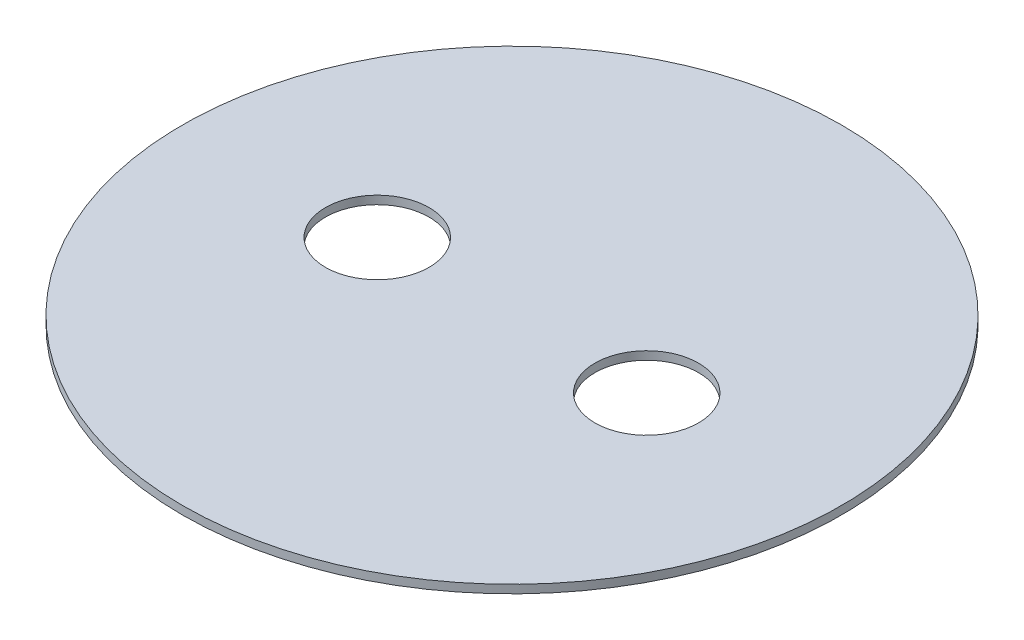
ISO-10303-21;
HEADER;
FILE_DESCRIPTION(('STEP AP214'),'2;1');
FILE_NAME('part.step','',(''),(''),'','','');
FILE_SCHEMA(('AUTOMOTIVE_DESIGN { 1 0 10303 214 1 1 1 1 }'));
ENDSEC;
DATA;
#1=APPLICATION_CONTEXT('core data for automotive mechanical design processes');
#2=APPLICATION_PROTOCOL_DEFINITION('international standard','automotive_design',2000,#1);
#3=PRODUCT_CONTEXT('',#1,'mechanical');
#4=PRODUCT('Part','Part','',(#3));
#5=PRODUCT_RELATED_PRODUCT_CATEGORY('part','',(#4));
#6=PRODUCT_DEFINITION_FORMATION('','',#4);
#7=PRODUCT_DEFINITION_CONTEXT('part definition',#1,'design');
#8=PRODUCT_DEFINITION('design','',#6,#7);
#9=PRODUCT_DEFINITION_SHAPE('','',#8);
#10=(LENGTH_UNIT() NAMED_UNIT(*) SI_UNIT(.MILLI.,.METRE.));
#11=(NAMED_UNIT(*) PLANE_ANGLE_UNIT() SI_UNIT($,.RADIAN.));
#12=(NAMED_UNIT(*) SI_UNIT($,.STERADIAN.) SOLID_ANGLE_UNIT());
#13=UNCERTAINTY_MEASURE_WITH_UNIT(LENGTH_MEASURE(1.E-05),#10,'distance_accuracy_value','');
#14=(GEOMETRIC_REPRESENTATION_CONTEXT(3) GLOBAL_UNCERTAINTY_ASSIGNED_CONTEXT((#13)) GLOBAL_UNIT_ASSIGNED_CONTEXT((#10,
#11,#12)) REPRESENTATION_CONTEXT('',''));
#15=CARTESIAN_POINT('',(0.,0.,0.));
#16=DIRECTION('',(0.,0.,1.));
#17=DIRECTION('',(1.,0.,0.));
#18=AXIS2_PLACEMENT_3D('',#15,#16,#17);
#19=CARTESIAN_POINT('',(0.,2.,0.));
#20=DIRECTION('',(0.,1.,0.));
#21=DIRECTION('',(0.,0.,1.));
#22=AXIS2_PLACEMENT_3D('',#19,#20,#21);
#23=PLANE('',#22);
#24=CARTESIAN_POINT('',(-32.5,2.,0.));
#25=DIRECTION('',(0.,1.,0.));
#26=DIRECTION('',(0.,0.,1.));
#27=AXIS2_PLACEMENT_3D('',#24,#25,#26);
#28=CIRCLE('',#27,12.5);
#29=CARTESIAN_POINT('',(-32.5,2.,12.5));
#30=VERTEX_POINT('',#29);
#31=EDGE_CURVE('E58',#30,#30,#28,.T.);
#32=ORIENTED_EDGE('',*,*,#31,.F.);
#33=EDGE_LOOP('',(#32));
#34=FACE_BOUND('',#33,.T.);
#35=CARTESIAN_POINT('',(0.,2.,0.));
#36=DIRECTION('',(0.,1.,0.));
#37=DIRECTION('',(0.,0.,1.));
#38=AXIS2_PLACEMENT_3D('',#35,#36,#37);
#39=CIRCLE('',#38,79.5);
#40=CARTESIAN_POINT('',(0.,2.,79.5));
#41=VERTEX_POINT('',#40);
#42=EDGE_CURVE('E11',#41,#41,#39,.T.);
#43=ORIENTED_EDGE('',*,*,#42,.T.);
#44=EDGE_LOOP('',(#43));
#45=FACE_BOUND('',#44,.T.);
#46=CARTESIAN_POINT('',(32.5,2.,0.));
#47=DIRECTION('',(0.,1.,0.));
#48=DIRECTION('',(0.,0.,1.));
#49=AXIS2_PLACEMENT_3D('',#46,#47,#48);
#50=CIRCLE('',#49,12.5);
#51=CARTESIAN_POINT('',(32.5,2.,12.5));
#52=VERTEX_POINT('',#51);
#53=EDGE_CURVE('E69',#52,#52,#50,.T.);
#54=ORIENTED_EDGE('',*,*,#53,.F.);
#55=EDGE_LOOP('',(#54));
#56=FACE_BOUND('',#55,.T.);
#57=ADVANCED_FACE('F41',(#34,#45,#56),#23,.T.);
#58=CARTESIAN_POINT('',(0.,0.,0.));
#59=DIRECTION('',(0.,1.,0.));
#60=DIRECTION('',(0.,0.,1.));
#61=AXIS2_PLACEMENT_3D('',#58,#59,#60);
#62=PLANE('',#61);
#63=CARTESIAN_POINT('',(0.,0.,0.));
#64=DIRECTION('',(0.,1.,0.));
#65=DIRECTION('',(0.,0.,1.));
#66=AXIS2_PLACEMENT_3D('',#63,#64,#65);
#67=CIRCLE('',#66,79.5);
#68=CARTESIAN_POINT('',(0.,0.,79.5));
#69=VERTEX_POINT('',#68);
#70=EDGE_CURVE('E46',#69,#69,#67,.T.);
#71=ORIENTED_EDGE('',*,*,#70,.F.);
#72=EDGE_LOOP('',(#71));
#73=FACE_BOUND('',#72,.T.);
#74=CARTESIAN_POINT('',(-32.5,0.,0.));
#75=DIRECTION('',(0.,1.,0.));
#76=DIRECTION('',(0.,0.,1.));
#77=AXIS2_PLACEMENT_3D('',#74,#75,#76);
#78=CIRCLE('',#77,12.5);
#79=CARTESIAN_POINT('',(-32.5,0.,12.5));
#80=VERTEX_POINT('',#79);
#81=EDGE_CURVE('E61',#80,#80,#78,.T.);
#82=ORIENTED_EDGE('',*,*,#81,.T.);
#83=EDGE_LOOP('',(#82));
#84=FACE_BOUND('',#83,.T.);
#85=CARTESIAN_POINT('',(32.5,0.,0.));
#86=DIRECTION('',(0.,1.,0.));
#87=DIRECTION('',(0.,0.,1.));
#88=AXIS2_PLACEMENT_3D('',#85,#86,#87);
#89=CIRCLE('',#88,12.5);
#90=CARTESIAN_POINT('',(32.5,0.,12.5));
#91=VERTEX_POINT('',#90);
#92=EDGE_CURVE('E72',#91,#91,#89,.T.);
#93=ORIENTED_EDGE('',*,*,#92,.T.);
#94=EDGE_LOOP('',(#93));
#95=FACE_BOUND('',#94,.T.);
#96=ADVANCED_FACE('F84',(#73,#84,#95),#62,.F.);
#97=CARTESIAN_POINT('',(0.,2.,0.));
#98=DIRECTION('',(0.,-1.,0.));
#99=DIRECTION('',(0.,0.,-1.));
#100=AXIS2_PLACEMENT_3D('',#97,#98,#99);
#101=CYLINDRICAL_SURFACE('',#100,79.5);
#102=ORIENTED_EDGE('',*,*,#42,.F.);
#103=EDGE_LOOP('',(#102));
#104=FACE_BOUND('',#103,.T.);
#105=ORIENTED_EDGE('',*,*,#70,.T.);
#106=EDGE_LOOP('',(#105));
#107=FACE_BOUND('',#106,.T.);
#108=ADVANCED_FACE('F44',(#104,#107),#101,.T.);
#109=CARTESIAN_POINT('',(-32.5,2.,0.));
#110=DIRECTION('',(0.,-1.,0.));
#111=DIRECTION('',(0.,0.,-1.));
#112=AXIS2_PLACEMENT_3D('',#109,#110,#111);
#113=CYLINDRICAL_SURFACE('',#112,12.5);
#114=ORIENTED_EDGE('',*,*,#31,.T.);
#115=EDGE_LOOP('',(#114));
#116=FACE_BOUND('',#115,.T.);
#117=ORIENTED_EDGE('',*,*,#81,.F.);
#118=EDGE_LOOP('',(#117));
#119=FACE_BOUND('',#118,.T.);
#120=ADVANCED_FACE('F87',(#116,#119),#113,.F.);
#121=CARTESIAN_POINT('',(32.5,2.,0.));
#122=DIRECTION('',(0.,-1.,0.));
#123=DIRECTION('',(0.,0.,-1.));
#124=AXIS2_PLACEMENT_3D('',#121,#122,#123);
#125=CYLINDRICAL_SURFACE('',#124,12.5);
#126=ORIENTED_EDGE('',*,*,#53,.T.);
#127=EDGE_LOOP('',(#126));
#128=FACE_BOUND('',#127,.T.);
#129=ORIENTED_EDGE('',*,*,#92,.F.);
#130=EDGE_LOOP('',(#129));
#131=FACE_BOUND('',#130,.T.);
#132=ADVANCED_FACE('F89',(#128,#131),#125,.F.);
#133=CLOSED_SHELL('',(#57,#96,#108,#120,#132));
#134=MANIFOLD_SOLID_BREP('B2',#133);
#135=ADVANCED_BREP_SHAPE_REPRESENTATION('',(#18,#134),#14);
#136=SHAPE_DEFINITION_REPRESENTATION(#9,#135);
ENDSEC;
END-ISO-10303-21;
